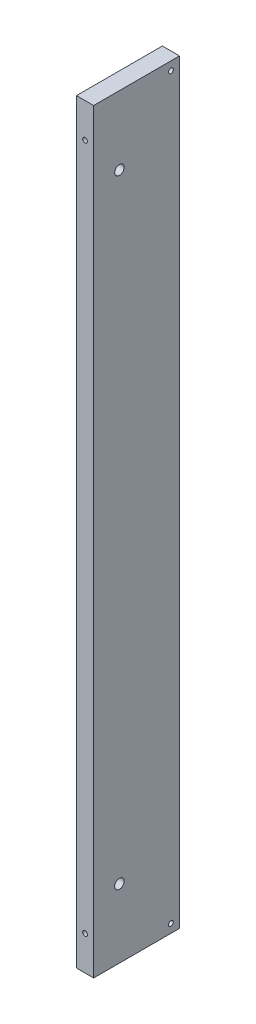
ISO-10303-21;
HEADER;
FILE_DESCRIPTION(('STEP AP214'),'2;1');
FILE_NAME('part.step','',(''),(''),'','','');
FILE_SCHEMA(('AUTOMOTIVE_DESIGN { 1 0 10303 214 1 1 1 1 }'));
ENDSEC;
DATA;
#1=APPLICATION_CONTEXT('core data for automotive mechanical design processes');
#2=APPLICATION_PROTOCOL_DEFINITION('international standard','automotive_design',2000,#1);
#3=PRODUCT_CONTEXT('',#1,'mechanical');
#4=PRODUCT('Part','Part','',(#3));
#5=PRODUCT_RELATED_PRODUCT_CATEGORY('part','',(#4));
#6=PRODUCT_DEFINITION_FORMATION('','',#4);
#7=PRODUCT_DEFINITION_CONTEXT('part definition',#1,'design');
#8=PRODUCT_DEFINITION('design','',#6,#7);
#9=PRODUCT_DEFINITION_SHAPE('','',#8);
#10=(LENGTH_UNIT() NAMED_UNIT(*) SI_UNIT(.MILLI.,.METRE.));
#11=(NAMED_UNIT(*) PLANE_ANGLE_UNIT() SI_UNIT($,.RADIAN.));
#12=(NAMED_UNIT(*) SI_UNIT($,.STERADIAN.) SOLID_ANGLE_UNIT());
#13=UNCERTAINTY_MEASURE_WITH_UNIT(LENGTH_MEASURE(1.E-05),#10,'distance_accuracy_value','');
#14=(GEOMETRIC_REPRESENTATION_CONTEXT(3) GLOBAL_UNCERTAINTY_ASSIGNED_CONTEXT((#13)) GLOBAL_UNIT_ASSIGNED_CONTEXT((#10,
#11,#12)) REPRESENTATION_CONTEXT('',''));
#15=CARTESIAN_POINT('',(0.,0.,0.));
#16=DIRECTION('',(0.,0.,1.));
#17=DIRECTION('',(1.,0.,0.));
#18=AXIS2_PLACEMENT_3D('',#15,#16,#17);
#19=CARTESIAN_POINT('',(0.,0.,50.));
#20=DIRECTION('',(1.,0.,0.));
#21=DIRECTION('',(0.,0.,-1.));
#22=AXIS2_PLACEMENT_3D('',#19,#20,#21);
#23=PLANE('',#22);
#24=CARTESIAN_POINT('',(0.,435.,5.));
#25=DIRECTION('',(-1.,0.,0.));
#26=DIRECTION('',(0.,0.,1.));
#27=AXIS2_PLACEMENT_3D('',#24,#25,#26);
#28=CIRCLE('',#27,1.4);
#29=CARTESIAN_POINT('',(0.,435.,6.4));
#30=VERTEX_POINT('',#29);
#31=EDGE_CURVE('E146',#30,#30,#28,.T.);
#32=ORIENTED_EDGE('',*,*,#31,.F.);
#33=EDGE_LOOP('',(#32));
#34=FACE_BOUND('',#33,.T.);
#35=CARTESIAN_POINT('',(0.,5.,5.));
#36=DIRECTION('',(-1.,0.,0.));
#37=DIRECTION('',(0.,0.,1.));
#38=AXIS2_PLACEMENT_3D('',#35,#36,#37);
#39=CIRCLE('',#38,1.4);
#40=CARTESIAN_POINT('',(0.,5.,6.4));
#41=VERTEX_POINT('',#40);
#42=EDGE_CURVE('E143',#41,#41,#39,.T.);
#43=ORIENTED_EDGE('',*,*,#42,.F.);
#44=EDGE_LOOP('',(#43));
#45=FACE_BOUND('',#44,.T.);
#46=CARTESIAN_POINT('',(0.,400.,35.));
#47=DIRECTION('',(-1.,0.,0.));
#48=DIRECTION('',(0.,0.,1.));
#49=AXIS2_PLACEMENT_3D('',#46,#47,#48);
#50=CIRCLE('',#49,2.75);
#51=CARTESIAN_POINT('',(0.,400.,37.75));
#52=VERTEX_POINT('',#51);
#53=EDGE_CURVE('E135',#52,#52,#50,.T.);
#54=ORIENTED_EDGE('',*,*,#53,.F.);
#55=EDGE_LOOP('',(#54));
#56=FACE_BOUND('',#55,.T.);
#57=CARTESIAN_POINT('',(0.,40.,35.));
#58=DIRECTION('',(-1.,0.,0.));
#59=DIRECTION('',(0.,0.,1.));
#60=AXIS2_PLACEMENT_3D('',#57,#58,#59);
#61=CIRCLE('',#60,2.75);
#62=CARTESIAN_POINT('',(0.,40.,37.75));
#63=VERTEX_POINT('',#62);
#64=EDGE_CURVE('E131',#63,#63,#61,.T.);
#65=ORIENTED_EDGE('',*,*,#64,.F.);
#66=EDGE_LOOP('',(#65));
#67=FACE_BOUND('',#66,.T.);
#68=DIRECTION('',(0.,-1.,0.));
#69=VECTOR('',#68,1.);
#70=CARTESIAN_POINT('',(0.,0.,0.));
#71=LINE('',#70,#69);
#72=CARTESIAN_POINT('',(0.,440.,0.));
#73=VERTEX_POINT('',#72);
#74=CARTESIAN_POINT('',(0.,0.,0.));
#75=VERTEX_POINT('',#74);
#76=EDGE_CURVE('E102',#73,#75,#71,.T.);
#77=ORIENTED_EDGE('',*,*,#76,.T.);
#78=DIRECTION('',(0.,0.,-1.));
#79=VECTOR('',#78,1.);
#80=CARTESIAN_POINT('',(0.,0.,50.));
#81=LINE('',#80,#79);
#82=CARTESIAN_POINT('',(0.,0.,50.));
#83=VERTEX_POINT('',#82);
#84=EDGE_CURVE('E11',#83,#75,#81,.T.);
#85=ORIENTED_EDGE('',*,*,#84,.F.);
#86=DIRECTION('',(0.,-1.,0.));
#87=VECTOR('',#86,1.);
#88=CARTESIAN_POINT('',(0.,0.,50.));
#89=LINE('',#88,#87);
#90=CARTESIAN_POINT('',(0.,440.,50.));
#91=VERTEX_POINT('',#90);
#92=EDGE_CURVE('E90',#91,#83,#89,.T.);
#93=ORIENTED_EDGE('',*,*,#92,.F.);
#94=DIRECTION('',(0.,0.,-1.));
#95=VECTOR('',#94,1.);
#96=CARTESIAN_POINT('',(0.,440.,50.));
#97=LINE('',#96,#95);
#98=EDGE_CURVE('E98',#91,#73,#97,.T.);
#99=ORIENTED_EDGE('',*,*,#98,.T.);
#100=EDGE_LOOP('',(#77,#85,#93,#99));
#101=FACE_BOUND('',#100,.T.);
#102=ADVANCED_FACE('F39',(#34,#45,#56,#67,#101),#23,.F.);
#103=CARTESIAN_POINT('',(0.,0.,50.));
#104=DIRECTION('',(0.,1.,0.));
#105=DIRECTION('',(0.,0.,1.));
#106=AXIS2_PLACEMENT_3D('',#103,#104,#105);
#107=PLANE('',#106);
#108=DIRECTION('',(1.,0.,0.));
#109=VECTOR('',#108,1.);
#110=CARTESIAN_POINT('',(0.,0.,0.));
#111=LINE('',#110,#109);
#112=CARTESIAN_POINT('',(10.,0.,0.));
#113=VERTEX_POINT('',#112);
#114=EDGE_CURVE('E94',#75,#113,#111,.T.);
#115=ORIENTED_EDGE('',*,*,#114,.T.);
#116=DIRECTION('',(0.,0.,-1.));
#117=VECTOR('',#116,1.);
#118=CARTESIAN_POINT('',(10.,0.,50.));
#119=LINE('',#118,#117);
#120=CARTESIAN_POINT('',(10.,0.,50.));
#121=VERTEX_POINT('',#120);
#122=EDGE_CURVE('E47',#121,#113,#119,.T.);
#123=ORIENTED_EDGE('',*,*,#122,.F.);
#124=DIRECTION('',(1.,0.,0.));
#125=VECTOR('',#124,1.);
#126=CARTESIAN_POINT('',(0.,0.,50.));
#127=LINE('',#126,#125);
#128=EDGE_CURVE('E85',#83,#121,#127,.T.);
#129=ORIENTED_EDGE('',*,*,#128,.F.);
#130=ORIENTED_EDGE('',*,*,#84,.T.);
#131=EDGE_LOOP('',(#115,#123,#129,#130));
#132=FACE_BOUND('',#131,.T.);
#133=ADVANCED_FACE('F93',(#132),#107,.F.);
#134=CARTESIAN_POINT('',(10.,0.,50.));
#135=DIRECTION('',(-1.,0.,0.));
#136=DIRECTION('',(0.,0.,1.));
#137=AXIS2_PLACEMENT_3D('',#134,#135,#136);
#138=PLANE('',#137);
#139=CARTESIAN_POINT('',(10.,435.,5.));
#140=DIRECTION('',(-1.,0.,0.));
#141=DIRECTION('',(0.,0.,1.));
#142=AXIS2_PLACEMENT_3D('',#139,#140,#141);
#143=CIRCLE('',#142,1.4);
#144=CARTESIAN_POINT('',(10.,435.,6.4));
#145=VERTEX_POINT('',#144);
#146=EDGE_CURVE('E132',#145,#145,#143,.T.);
#147=ORIENTED_EDGE('',*,*,#146,.T.);
#148=EDGE_LOOP('',(#147));
#149=FACE_BOUND('',#148,.T.);
#150=CARTESIAN_POINT('',(10.,5.,5.));
#151=DIRECTION('',(-1.,0.,0.));
#152=DIRECTION('',(0.,0.,1.));
#153=AXIS2_PLACEMENT_3D('',#150,#151,#152);
#154=CIRCLE('',#153,1.4);
#155=CARTESIAN_POINT('',(10.,5.,6.4));
#156=VERTEX_POINT('',#155);
#157=EDGE_CURVE('E140',#156,#156,#154,.T.);
#158=ORIENTED_EDGE('',*,*,#157,.T.);
#159=EDGE_LOOP('',(#158));
#160=FACE_BOUND('',#159,.T.);
#161=CARTESIAN_POINT('',(10.,400.,35.));
#162=DIRECTION('',(-1.,0.,0.));
#163=DIRECTION('',(0.,0.,1.));
#164=AXIS2_PLACEMENT_3D('',#161,#162,#163);
#165=CIRCLE('',#164,2.75);
#166=CARTESIAN_POINT('',(10.,400.,37.75));
#167=VERTEX_POINT('',#166);
#168=EDGE_CURVE('E120',#167,#167,#165,.T.);
#169=ORIENTED_EDGE('',*,*,#168,.T.);
#170=EDGE_LOOP('',(#169));
#171=FACE_BOUND('',#170,.T.);
#172=CARTESIAN_POINT('',(10.,40.,35.));
#173=DIRECTION('',(-1.,0.,0.));
#174=DIRECTION('',(0.,0.,1.));
#175=AXIS2_PLACEMENT_3D('',#172,#173,#174);
#176=CIRCLE('',#175,2.75);
#177=CARTESIAN_POINT('',(10.,40.,37.75));
#178=VERTEX_POINT('',#177);
#179=EDGE_CURVE('E128',#178,#178,#176,.T.);
#180=ORIENTED_EDGE('',*,*,#179,.T.);
#181=EDGE_LOOP('',(#180));
#182=FACE_BOUND('',#181,.T.);
#183=DIRECTION('',(0.,1.,0.));
#184=VECTOR('',#183,1.);
#185=CARTESIAN_POINT('',(10.,0.,0.));
#186=LINE('',#185,#184);
#187=CARTESIAN_POINT('',(10.,440.,0.));
#188=VERTEX_POINT('',#187);
#189=EDGE_CURVE('E72',#113,#188,#186,.T.);
#190=ORIENTED_EDGE('',*,*,#189,.T.);
#191=DIRECTION('',(0.,0.,-1.));
#192=VECTOR('',#191,1.);
#193=CARTESIAN_POINT('',(10.,440.,50.));
#194=LINE('',#193,#192);
#195=CARTESIAN_POINT('',(10.,440.,50.));
#196=VERTEX_POINT('',#195);
#197=EDGE_CURVE('E95',#196,#188,#194,.T.);
#198=ORIENTED_EDGE('',*,*,#197,.F.);
#199=DIRECTION('',(0.,1.,0.));
#200=VECTOR('',#199,1.);
#201=CARTESIAN_POINT('',(10.,0.,50.));
#202=LINE('',#201,#200);
#203=EDGE_CURVE('E88',#121,#196,#202,.T.);
#204=ORIENTED_EDGE('',*,*,#203,.F.);
#205=ORIENTED_EDGE('',*,*,#122,.T.);
#206=EDGE_LOOP('',(#190,#198,#204,#205));
#207=FACE_BOUND('',#206,.T.);
#208=ADVANCED_FACE('F96',(#149,#160,#171,#182,#207),#138,.F.);
#209=CARTESIAN_POINT('',(0.,440.,50.));
#210=DIRECTION('',(0.,-1.,0.));
#211=DIRECTION('',(0.,0.,-1.));
#212=AXIS2_PLACEMENT_3D('',#209,#210,#211);
#213=PLANE('',#212);
#214=DIRECTION('',(-1.,0.,0.));
#215=VECTOR('',#214,1.);
#216=CARTESIAN_POINT('',(0.,440.,0.));
#217=LINE('',#216,#215);
#218=EDGE_CURVE('E78',#188,#73,#217,.T.);
#219=ORIENTED_EDGE('',*,*,#218,.T.);
#220=ORIENTED_EDGE('',*,*,#98,.F.);
#221=DIRECTION('',(-1.,0.,0.));
#222=VECTOR('',#221,1.);
#223=CARTESIAN_POINT('',(0.,440.,50.));
#224=LINE('',#223,#222);
#225=EDGE_CURVE('E55',#196,#91,#224,.T.);
#226=ORIENTED_EDGE('',*,*,#225,.F.);
#227=ORIENTED_EDGE('',*,*,#197,.T.);
#228=EDGE_LOOP('',(#219,#220,#226,#227));
#229=FACE_BOUND('',#228,.T.);
#230=ADVANCED_FACE('F110',(#229),#213,.F.);
#231=CARTESIAN_POINT('',(0.,0.,50.));
#232=DIRECTION('',(0.,0.,-1.));
#233=DIRECTION('',(-1.,0.,0.));
#234=AXIS2_PLACEMENT_3D('',#231,#232,#233);
#235=PLANE('',#234);
#236=CARTESIAN_POINT('',(5.,420.,50.));
#237=DIRECTION('',(0.,0.,1.));
#238=DIRECTION('',(1.,0.,0.));
#239=AXIS2_PLACEMENT_3D('',#236,#237,#238);
#240=CIRCLE('',#239,1.4);
#241=CARTESIAN_POINT('',(6.4,420.,50.));
#242=VERTEX_POINT('',#241);
#243=EDGE_CURVE('E123',#242,#242,#240,.T.);
#244=ORIENTED_EDGE('',*,*,#243,.F.);
#245=EDGE_LOOP('',(#244));
#246=FACE_BOUND('',#245,.T.);
#247=CARTESIAN_POINT('',(5.,20.,50.));
#248=DIRECTION('',(0.,0.,1.));
#249=DIRECTION('',(1.,0.,0.));
#250=AXIS2_PLACEMENT_3D('',#247,#248,#249);
#251=CIRCLE('',#250,1.4);
#252=CARTESIAN_POINT('',(6.4,20.,50.));
#253=VERTEX_POINT('',#252);
#254=EDGE_CURVE('E119',#253,#253,#251,.T.);
#255=ORIENTED_EDGE('',*,*,#254,.F.);
#256=EDGE_LOOP('',(#255));
#257=FACE_BOUND('',#256,.T.);
#258=ORIENTED_EDGE('',*,*,#92,.T.);
#259=ORIENTED_EDGE('',*,*,#128,.T.);
#260=ORIENTED_EDGE('',*,*,#203,.T.);
#261=ORIENTED_EDGE('',*,*,#225,.T.);
#262=EDGE_LOOP('',(#258,#259,#260,#261));
#263=FACE_BOUND('',#262,.T.);
#264=ADVANCED_FACE('F86',(#246,#257,#263),#235,.F.);
#265=CARTESIAN_POINT('',(0.,0.,0.));
#266=DIRECTION('',(0.,0.,-1.));
#267=DIRECTION('',(-1.,0.,0.));
#268=AXIS2_PLACEMENT_3D('',#265,#266,#267);
#269=PLANE('',#268);
#270=ORIENTED_EDGE('',*,*,#76,.F.);
#271=ORIENTED_EDGE('',*,*,#218,.F.);
#272=ORIENTED_EDGE('',*,*,#189,.F.);
#273=ORIENTED_EDGE('',*,*,#114,.F.);
#274=EDGE_LOOP('',(#270,#271,#272,#273));
#275=FACE_BOUND('',#274,.T.);
#276=ADVANCED_FACE('F113',(#275),#269,.T.);
#277=CARTESIAN_POINT('',(5.,20.,40.));
#278=DIRECTION('',(0.,0.,1.));
#279=DIRECTION('',(1.,0.,0.));
#280=AXIS2_PLACEMENT_3D('',#277,#278,#279);
#281=CYLINDRICAL_SURFACE('',#280,1.4);
#282=CARTESIAN_POINT('',(5.,20.,40.));
#283=DIRECTION('',(0.,0.,1.));
#284=DIRECTION('',(1.,0.,0.));
#285=AXIS2_PLACEMENT_3D('',#282,#283,#284);
#286=CIRCLE('',#285,1.4);
#287=CARTESIAN_POINT('',(6.4,20.,40.));
#288=VERTEX_POINT('',#287);
#289=EDGE_CURVE('E116',#288,#288,#286,.T.);
#290=ORIENTED_EDGE('',*,*,#289,.F.);
#291=EDGE_LOOP('',(#290));
#292=FACE_BOUND('',#291,.T.);
#293=ORIENTED_EDGE('',*,*,#254,.T.);
#294=EDGE_LOOP('',(#293));
#295=FACE_BOUND('',#294,.T.);
#296=ADVANCED_FACE('F191',(#292,#295),#281,.F.);
#297=CARTESIAN_POINT('',(5.,20.,40.));
#298=DIRECTION('',(0.,0.,1.));
#299=DIRECTION('',(1.,0.,0.));
#300=AXIS2_PLACEMENT_3D('',#297,#298,#299);
#301=PLANE('',#300);
#302=ORIENTED_EDGE('',*,*,#289,.T.);
#303=EDGE_LOOP('',(#302));
#304=FACE_BOUND('',#303,.T.);
#305=ADVANCED_FACE('F189',(#304),#301,.T.);
#306=CARTESIAN_POINT('',(5.,420.,40.));
#307=DIRECTION('',(0.,0.,1.));
#308=DIRECTION('',(1.,0.,0.));
#309=AXIS2_PLACEMENT_3D('',#306,#307,#308);
#310=CYLINDRICAL_SURFACE('',#309,1.4);
#311=CARTESIAN_POINT('',(5.,420.,40.));
#312=DIRECTION('',(0.,0.,1.));
#313=DIRECTION('',(1.,0.,0.));
#314=AXIS2_PLACEMENT_3D('',#311,#312,#313);
#315=CIRCLE('',#314,1.4);
#316=CARTESIAN_POINT('',(6.4,420.,40.));
#317=VERTEX_POINT('',#316);
#318=EDGE_CURVE('E105',#317,#317,#315,.T.);
#319=ORIENTED_EDGE('',*,*,#318,.F.);
#320=EDGE_LOOP('',(#319));
#321=FACE_BOUND('',#320,.T.);
#322=ORIENTED_EDGE('',*,*,#243,.T.);
#323=EDGE_LOOP('',(#322));
#324=FACE_BOUND('',#323,.T.);
#325=ADVANCED_FACE('F181',(#321,#324),#310,.F.);
#326=CARTESIAN_POINT('',(5.,420.,40.));
#327=DIRECTION('',(0.,0.,1.));
#328=DIRECTION('',(1.,0.,0.));
#329=AXIS2_PLACEMENT_3D('',#326,#327,#328);
#330=PLANE('',#329);
#331=ORIENTED_EDGE('',*,*,#318,.T.);
#332=EDGE_LOOP('',(#331));
#333=FACE_BOUND('',#332,.T.);
#334=ADVANCED_FACE('F172',(#333),#330,.T.);
#335=CARTESIAN_POINT('',(10.,40.,35.));
#336=DIRECTION('',(-1.,0.,0.));
#337=DIRECTION('',(0.,0.,1.));
#338=AXIS2_PLACEMENT_3D('',#335,#336,#337);
#339=CYLINDRICAL_SURFACE('',#338,2.75);
#340=ORIENTED_EDGE('',*,*,#179,.F.);
#341=EDGE_LOOP('',(#340));
#342=FACE_BOUND('',#341,.T.);
#343=ORIENTED_EDGE('',*,*,#64,.T.);
#344=EDGE_LOOP('',(#343));
#345=FACE_BOUND('',#344,.T.);
#346=ADVANCED_FACE('F169',(#342,#345),#339,.F.);
#347=CARTESIAN_POINT('',(10.,400.,35.));
#348=DIRECTION('',(-1.,0.,0.));
#349=DIRECTION('',(0.,0.,1.));
#350=AXIS2_PLACEMENT_3D('',#347,#348,#349);
#351=CYLINDRICAL_SURFACE('',#350,2.75);
#352=ORIENTED_EDGE('',*,*,#168,.F.);
#353=EDGE_LOOP('',(#352));
#354=FACE_BOUND('',#353,.T.);
#355=ORIENTED_EDGE('',*,*,#53,.T.);
#356=EDGE_LOOP('',(#355));
#357=FACE_BOUND('',#356,.T.);
#358=ADVANCED_FACE('F171',(#354,#357),#351,.F.);
#359=CARTESIAN_POINT('',(10.,5.,5.));
#360=DIRECTION('',(-1.,0.,0.));
#361=DIRECTION('',(0.,0.,1.));
#362=AXIS2_PLACEMENT_3D('',#359,#360,#361);
#363=CYLINDRICAL_SURFACE('',#362,1.4);
#364=ORIENTED_EDGE('',*,*,#157,.F.);
#365=EDGE_LOOP('',(#364));
#366=FACE_BOUND('',#365,.T.);
#367=ORIENTED_EDGE('',*,*,#42,.T.);
#368=EDGE_LOOP('',(#367));
#369=FACE_BOUND('',#368,.T.);
#370=ADVANCED_FACE('F157',(#366,#369),#363,.F.);
#371=CARTESIAN_POINT('',(10.,435.,5.));
#372=DIRECTION('',(-1.,0.,0.));
#373=DIRECTION('',(0.,0.,1.));
#374=AXIS2_PLACEMENT_3D('',#371,#372,#373);
#375=CYLINDRICAL_SURFACE('',#374,1.4);
#376=ORIENTED_EDGE('',*,*,#146,.F.);
#377=EDGE_LOOP('',(#376));
#378=FACE_BOUND('',#377,.T.);
#379=ORIENTED_EDGE('',*,*,#31,.T.);
#380=EDGE_LOOP('',(#379));
#381=FACE_BOUND('',#380,.T.);
#382=ADVANCED_FACE('F154',(#378,#381),#375,.F.);
#383=CLOSED_SHELL('',(#102,#133,#208,#230,#264,#276,#296,#305,#325,#334,#346,#358,#370,#382));
#384=MANIFOLD_SOLID_BREP('B2',#383);
#385=ADVANCED_BREP_SHAPE_REPRESENTATION('',(#18,#384),#14);
#386=SHAPE_DEFINITION_REPRESENTATION(#9,#385);
ENDSEC;
END-ISO-10303-21;
